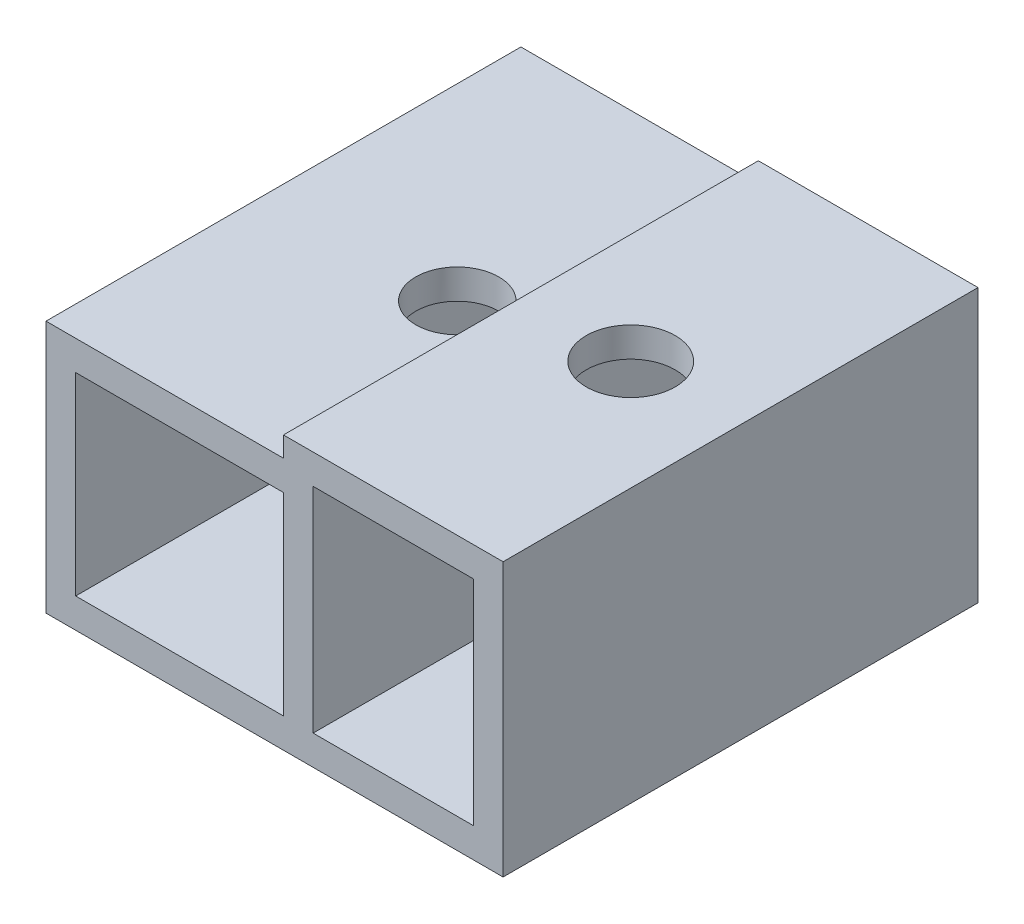
ISO-10303-21;
HEADER;
FILE_DESCRIPTION(('STEP AP214'),'2;1');
FILE_NAME('part.step','',(''),(''),'','','');
FILE_SCHEMA(('AUTOMOTIVE_DESIGN { 1 0 10303 214 1 1 1 1 }'));
ENDSEC;
DATA;
#1=APPLICATION_CONTEXT('core data for automotive mechanical design processes');
#2=APPLICATION_PROTOCOL_DEFINITION('international standard','automotive_design',2000,#1);
#3=PRODUCT_CONTEXT('',#1,'mechanical');
#4=PRODUCT('Part','Part','',(#3));
#5=PRODUCT_RELATED_PRODUCT_CATEGORY('part','',(#4));
#6=PRODUCT_DEFINITION_FORMATION('','',#4);
#7=PRODUCT_DEFINITION_CONTEXT('part definition',#1,'design');
#8=PRODUCT_DEFINITION('design','',#6,#7);
#9=PRODUCT_DEFINITION_SHAPE('','',#8);
#10=(LENGTH_UNIT() NAMED_UNIT(*) SI_UNIT(.MILLI.,.METRE.));
#11=(NAMED_UNIT(*) PLANE_ANGLE_UNIT() SI_UNIT($,.RADIAN.));
#12=(NAMED_UNIT(*) SI_UNIT($,.STERADIAN.) SOLID_ANGLE_UNIT());
#13=UNCERTAINTY_MEASURE_WITH_UNIT(LENGTH_MEASURE(1.E-05),#10,'distance_accuracy_value','');
#14=(GEOMETRIC_REPRESENTATION_CONTEXT(3) GLOBAL_UNCERTAINTY_ASSIGNED_CONTEXT((#13)) GLOBAL_UNIT_ASSIGNED_CONTEXT((#10,
#11,#12)) REPRESENTATION_CONTEXT('',''));
#15=CARTESIAN_POINT('',(0.,0.,0.));
#16=DIRECTION('',(0.,0.,1.));
#17=DIRECTION('',(1.,0.,0.));
#18=AXIS2_PLACEMENT_3D('',#15,#16,#17);
#19=CARTESIAN_POINT('',(0.,6.34999999999998,101.6));
#20=DIRECTION('',(0.,-1.,0.));
#21=DIRECTION('',(1.,0.,0.));
#22=AXIS2_PLACEMENT_3D('',#19,#20,#21);
#23=PLANE('',#22);
#24=DIRECTION('',(-1.,0.,0.));
#25=VECTOR('',#24,1.);
#26=CARTESIAN_POINT('',(0.,6.34999999999998,0.));
#27=LINE('',#26,#25);
#28=CARTESIAN_POINT('',(91.44,6.35,0.));
#29=VERTEX_POINT('',#28);
#30=CARTESIAN_POINT('',(57.15,6.34999999999999,0.));
#31=VERTEX_POINT('',#30);
#32=EDGE_CURVE('E192',#29,#31,#27,.T.);
#33=ORIENTED_EDGE('',*,*,#32,.T.);
#34=DIRECTION('',(0.,0.,-1.));
#35=VECTOR('',#34,1.);
#36=CARTESIAN_POINT('',(57.15,6.34999999999999,101.6));
#37=LINE('',#36,#35);
#38=CARTESIAN_POINT('',(57.15,6.34999999999999,101.6));
#39=VERTEX_POINT('',#38);
#40=EDGE_CURVE('E11',#39,#31,#37,.T.);
#41=ORIENTED_EDGE('',*,*,#40,.F.);
#42=DIRECTION('',(-1.,0.,0.));
#43=VECTOR('',#42,1.);
#44=CARTESIAN_POINT('',(0.,6.34999999999998,101.6));
#45=LINE('',#44,#43);
#46=CARTESIAN_POINT('',(91.44,6.35,101.6));
#47=VERTEX_POINT('',#46);
#48=EDGE_CURVE('E149',#47,#39,#45,.T.);
#49=ORIENTED_EDGE('',*,*,#48,.F.);
#50=DIRECTION('',(0.,0.,-1.));
#51=VECTOR('',#50,1.);
#52=CARTESIAN_POINT('',(91.44,6.35,101.6));
#53=LINE('',#52,#51);
#54=EDGE_CURVE('E200',#47,#29,#53,.T.);
#55=ORIENTED_EDGE('',*,*,#54,.T.);
#56=EDGE_LOOP('',(#33,#41,#49,#55));
#57=FACE_BOUND('',#56,.T.);
#58=ADVANCED_FACE('F35',(#57),#23,.F.);
#59=CARTESIAN_POINT('',(57.15,0.,101.6));
#60=DIRECTION('',(-1.,0.,0.));
#61=DIRECTION('',(0.,0.,1.));
#62=AXIS2_PLACEMENT_3D('',#59,#60,#61);
#63=PLANE('',#62);
#64=DIRECTION('',(0.,1.,0.));
#65=VECTOR('',#64,1.);
#66=CARTESIAN_POINT('',(57.15,0.,0.));
#67=LINE('',#66,#65);
#68=CARTESIAN_POINT('',(57.15,52.07,0.));
#69=VERTEX_POINT('',#68);
#70=EDGE_CURVE('E155',#31,#69,#67,.T.);
#71=ORIENTED_EDGE('',*,*,#70,.T.);
#72=DIRECTION('',(0.,0.,-1.));
#73=VECTOR('',#72,1.);
#74=CARTESIAN_POINT('',(57.15,52.07,101.6));
#75=LINE('',#74,#73);
#76=CARTESIAN_POINT('',(57.15,52.07,101.6));
#77=VERTEX_POINT('',#76);
#78=EDGE_CURVE('E45',#77,#69,#75,.T.);
#79=ORIENTED_EDGE('',*,*,#78,.F.);
#80=DIRECTION('',(0.,1.,0.));
#81=VECTOR('',#80,1.);
#82=CARTESIAN_POINT('',(57.15,0.,101.6));
#83=LINE('',#82,#81);
#84=EDGE_CURVE('E143',#39,#77,#83,.T.);
#85=ORIENTED_EDGE('',*,*,#84,.F.);
#86=ORIENTED_EDGE('',*,*,#40,.T.);
#87=EDGE_LOOP('',(#71,#79,#85,#86));
#88=FACE_BOUND('',#87,.T.);
#89=ADVANCED_FACE('F154',(#88),#63,.F.);
#90=CARTESIAN_POINT('',(0.,52.07,101.6));
#91=DIRECTION('',(0.,-1.,0.));
#92=DIRECTION('',(1.,0.,0.));
#93=AXIS2_PLACEMENT_3D('',#90,#91,#92);
#94=PLANE('',#93);
#95=CARTESIAN_POINT('',(74.295,52.07,50.8));
#96=DIRECTION('',(0.,-1.,0.));
#97=DIRECTION('',(1.,0.,0.));
#98=AXIS2_PLACEMENT_3D('',#95,#96,#97);
#99=CIRCLE('',#98,9.52500000000001);
#100=CARTESIAN_POINT('',(83.82,52.07,50.8));
#101=VERTEX_POINT('',#100);
#102=EDGE_CURVE('E170',#101,#101,#99,.T.);
#103=ORIENTED_EDGE('',*,*,#102,.F.);
#104=EDGE_LOOP('',(#103));
#105=FACE_BOUND('',#104,.T.);
#106=DIRECTION('',(-1.,0.,0.));
#107=VECTOR('',#106,1.);
#108=CARTESIAN_POINT('',(0.,52.07,0.));
#109=LINE('',#108,#107);
#110=CARTESIAN_POINT('',(91.44,52.07,0.));
#111=VERTEX_POINT('',#110);
#112=EDGE_CURVE('E196',#111,#69,#109,.T.);
#113=ORIENTED_EDGE('',*,*,#112,.F.);
#114=DIRECTION('',(0.,0.,-1.));
#115=VECTOR('',#114,1.);
#116=CARTESIAN_POINT('',(91.44,52.07,101.6));
#117=LINE('',#116,#115);
#118=CARTESIAN_POINT('',(91.44,52.07,101.6));
#119=VERTEX_POINT('',#118);
#120=EDGE_CURVE('E100',#119,#111,#117,.T.);
#121=ORIENTED_EDGE('',*,*,#120,.F.);
#122=DIRECTION('',(-1.,0.,0.));
#123=VECTOR('',#122,1.);
#124=CARTESIAN_POINT('',(0.,52.07,101.6));
#125=LINE('',#124,#123);
#126=EDGE_CURVE('E147',#119,#77,#125,.T.);
#127=ORIENTED_EDGE('',*,*,#126,.T.);
#128=ORIENTED_EDGE('',*,*,#78,.T.);
#129=EDGE_LOOP('',(#113,#121,#127,#128));
#130=FACE_BOUND('',#129,.T.);
#131=ADVANCED_FACE('F160',(#105,#130),#94,.T.);
#132=CARTESIAN_POINT('',(0.,54.102,101.6));
#133=DIRECTION('',(0.,-1.,0.));
#134=DIRECTION('',(0.,0.,-1.));
#135=AXIS2_PLACEMENT_3D('',#132,#133,#134);
#136=PLANE('',#135);
#137=CARTESIAN_POINT('',(40.2406408631118,54.102,53.848));
#138=DIRECTION('',(0.,1.,0.));
#139=DIRECTION('',(0.,0.,1.));
#140=AXIS2_PLACEMENT_3D('',#137,#138,#139);
#141=CIRCLE('',#140,8.88999999999999);
#142=CARTESIAN_POINT('',(40.2406408631118,54.102,62.738));
#143=VERTEX_POINT('',#142);
#144=EDGE_CURVE('E345',#143,#143,#141,.T.);
#145=ORIENTED_EDGE('',*,*,#144,.F.);
#146=EDGE_LOOP('',(#145));
#147=FACE_BOUND('',#146,.T.);
#148=DIRECTION('',(-1.,0.,0.));
#149=VECTOR('',#148,1.);
#150=CARTESIAN_POINT('',(0.,54.102,0.));
#151=LINE('',#150,#149);
#152=CARTESIAN_POINT('',(50.8,54.102,0.));
#153=VERTEX_POINT('',#152);
#154=CARTESIAN_POINT('',(0.,54.102,0.));
#155=VERTEX_POINT('',#154);
#156=EDGE_CURVE('E179',#153,#155,#151,.T.);
#157=ORIENTED_EDGE('',*,*,#156,.T.);
#158=DIRECTION('',(0.,0.,-1.));
#159=VECTOR('',#158,1.);
#160=CARTESIAN_POINT('',(0.,54.102,101.6));
#161=LINE('',#160,#159);
#162=CARTESIAN_POINT('',(0.,54.102,101.6));
#163=VERTEX_POINT('',#162);
#164=EDGE_CURVE('E202',#163,#155,#161,.T.);
#165=ORIENTED_EDGE('',*,*,#164,.F.);
#166=DIRECTION('',(-1.,0.,0.));
#167=VECTOR('',#166,1.);
#168=CARTESIAN_POINT('',(0.,54.102,101.6));
#169=LINE('',#168,#167);
#170=CARTESIAN_POINT('',(50.8,54.102,101.6));
#171=VERTEX_POINT('',#170);
#172=EDGE_CURVE('E252',#171,#163,#169,.T.);
#173=ORIENTED_EDGE('',*,*,#172,.F.);
#174=DIRECTION('',(0.,0.,-1.));
#175=VECTOR('',#174,1.);
#176=CARTESIAN_POINT('',(50.8,54.102,101.6));
#177=LINE('',#176,#175);
#178=EDGE_CURVE('E204',#171,#153,#177,.T.);
#179=ORIENTED_EDGE('',*,*,#178,.T.);
#180=EDGE_LOOP('',(#157,#165,#173,#179));
#181=FACE_BOUND('',#180,.T.);
#182=ADVANCED_FACE('F275',(#147,#181),#136,.F.);
#183=CARTESIAN_POINT('',(0.,0.,101.6));
#184=DIRECTION('',(1.,0.,0.));
#185=DIRECTION('',(0.,1.,0.));
#186=AXIS2_PLACEMENT_3D('',#183,#184,#185);
#187=PLANE('',#186);
#188=DIRECTION('',(0.,-1.,0.));
#189=VECTOR('',#188,1.);
#190=CARTESIAN_POINT('',(0.,0.,0.));
#191=LINE('',#190,#189);
#192=CARTESIAN_POINT('',(0.,0.,0.));
#193=VERTEX_POINT('',#192);
#194=EDGE_CURVE('E182',#155,#193,#191,.T.);
#195=ORIENTED_EDGE('',*,*,#194,.T.);
#196=DIRECTION('',(0.,0.,-1.));
#197=VECTOR('',#196,1.);
#198=CARTESIAN_POINT('',(0.,0.,101.6));
#199=LINE('',#198,#197);
#200=CARTESIAN_POINT('',(0.,0.,101.6));
#201=VERTEX_POINT('',#200);
#202=EDGE_CURVE('E216',#201,#193,#199,.T.);
#203=ORIENTED_EDGE('',*,*,#202,.F.);
#204=DIRECTION('',(0.,-1.,0.));
#205=VECTOR('',#204,1.);
#206=CARTESIAN_POINT('',(0.,0.,101.6));
#207=LINE('',#206,#205);
#208=EDGE_CURVE('E255',#163,#201,#207,.T.);
#209=ORIENTED_EDGE('',*,*,#208,.F.);
#210=ORIENTED_EDGE('',*,*,#164,.T.);
#211=EDGE_LOOP('',(#195,#203,#209,#210));
#212=FACE_BOUND('',#211,.T.);
#213=ADVANCED_FACE('F277',(#212),#187,.F.);
#214=CARTESIAN_POINT('',(0.,0.,101.6));
#215=DIRECTION('',(0.,1.,0.));
#216=DIRECTION('',(0.,0.,1.));
#217=AXIS2_PLACEMENT_3D('',#214,#215,#216);
#218=PLANE('',#217);
#219=CARTESIAN_POINT('',(40.132,0.,53.848));
#220=DIRECTION('',(0.,1.,0.));
#221=DIRECTION('',(0.,0.,1.));
#222=AXIS2_PLACEMENT_3D('',#219,#220,#221);
#223=CIRCLE('',#222,8.5725);
#224=CARTESIAN_POINT('',(40.132,0.,62.4205));
#225=VERTEX_POINT('',#224);
#226=EDGE_CURVE('E342',#225,#225,#223,.T.);
#227=ORIENTED_EDGE('',*,*,#226,.T.);
#228=EDGE_LOOP('',(#227));
#229=FACE_BOUND('',#228,.T.);
#230=DIRECTION('',(1.,0.,0.));
#231=VECTOR('',#230,1.);
#232=CARTESIAN_POINT('',(0.,0.,0.));
#233=LINE('',#232,#231);
#234=CARTESIAN_POINT('',(97.79,0.,0.));
#235=VERTEX_POINT('',#234);
#236=EDGE_CURVE('E184',#193,#235,#233,.T.);
#237=ORIENTED_EDGE('',*,*,#236,.T.);
#238=DIRECTION('',(0.,0.,-1.));
#239=VECTOR('',#238,1.);
#240=CARTESIAN_POINT('',(97.79,0.,101.6));
#241=LINE('',#240,#239);
#242=CARTESIAN_POINT('',(97.79,0.,101.6));
#243=VERTEX_POINT('',#242);
#244=EDGE_CURVE('E213',#243,#235,#241,.T.);
#245=ORIENTED_EDGE('',*,*,#244,.F.);
#246=DIRECTION('',(1.,0.,0.));
#247=VECTOR('',#246,1.);
#248=CARTESIAN_POINT('',(0.,0.,101.6));
#249=LINE('',#248,#247);
#250=EDGE_CURVE('E257',#201,#243,#249,.T.);
#251=ORIENTED_EDGE('',*,*,#250,.F.);
#252=ORIENTED_EDGE('',*,*,#202,.T.);
#253=EDGE_LOOP('',(#237,#245,#251,#252));
#254=FACE_BOUND('',#253,.T.);
#255=ADVANCED_FACE('F284',(#229,#254),#218,.F.);
#256=CARTESIAN_POINT('',(97.79,0.,101.6));
#257=DIRECTION('',(-1.,0.,0.));
#258=DIRECTION('',(0.,-1.,0.));
#259=AXIS2_PLACEMENT_3D('',#256,#257,#258);
#260=PLANE('',#259);
#261=DIRECTION('',(0.,1.,0.));
#262=VECTOR('',#261,1.);
#263=CARTESIAN_POINT('',(97.79,0.,0.));
#264=LINE('',#263,#262);
#265=CARTESIAN_POINT('',(97.79,58.42,0.));
#266=VERTEX_POINT('',#265);
#267=EDGE_CURVE('E186',#235,#266,#264,.T.);
#268=ORIENTED_EDGE('',*,*,#267,.T.);
#269=DIRECTION('',(0.,0.,-1.));
#270=VECTOR('',#269,1.);
#271=CARTESIAN_POINT('',(97.79,58.42,101.6));
#272=LINE('',#271,#270);
#273=CARTESIAN_POINT('',(97.79,58.42,101.6));
#274=VERTEX_POINT('',#273);
#275=EDGE_CURVE('E210',#274,#266,#272,.T.);
#276=ORIENTED_EDGE('',*,*,#275,.F.);
#277=DIRECTION('',(0.,1.,0.));
#278=VECTOR('',#277,1.);
#279=CARTESIAN_POINT('',(97.79,0.,101.6));
#280=LINE('',#279,#278);
#281=EDGE_CURVE('E259',#243,#274,#280,.T.);
#282=ORIENTED_EDGE('',*,*,#281,.F.);
#283=ORIENTED_EDGE('',*,*,#244,.T.);
#284=EDGE_LOOP('',(#268,#276,#282,#283));
#285=FACE_BOUND('',#284,.T.);
#286=ADVANCED_FACE('F288',(#285),#260,.F.);
#287=CARTESIAN_POINT('',(0.,58.42,101.6));
#288=DIRECTION('',(0.,-1.,0.));
#289=DIRECTION('',(1.,0.,0.));
#290=AXIS2_PLACEMENT_3D('',#287,#288,#289);
#291=PLANE('',#290);
#292=CARTESIAN_POINT('',(74.295,58.42,50.8));
#293=DIRECTION('',(0.,1.,0.));
#294=DIRECTION('',(-1.,0.,0.));
#295=AXIS2_PLACEMENT_3D('',#292,#293,#294);
#296=CIRCLE('',#295,9.52500000000001);
#297=CARTESIAN_POINT('',(64.77,58.42,50.8));
#298=VERTEX_POINT('',#297);
#299=EDGE_CURVE('E350',#298,#298,#296,.T.);
#300=ORIENTED_EDGE('',*,*,#299,.F.);
#301=EDGE_LOOP('',(#300));
#302=FACE_BOUND('',#301,.T.);
#303=DIRECTION('',(-1.,0.,0.));
#304=VECTOR('',#303,1.);
#305=CARTESIAN_POINT('',(0.,58.42,0.));
#306=LINE('',#305,#304);
#307=CARTESIAN_POINT('',(50.8,58.42,0.));
#308=VERTEX_POINT('',#307);
#309=EDGE_CURVE('E188',#266,#308,#306,.T.);
#310=ORIENTED_EDGE('',*,*,#309,.T.);
#311=DIRECTION('',(0.,0.,-1.));
#312=VECTOR('',#311,1.);
#313=CARTESIAN_POINT('',(50.8,58.42,101.6));
#314=LINE('',#313,#312);
#315=CARTESIAN_POINT('',(50.8,58.42,101.6));
#316=VERTEX_POINT('',#315);
#317=EDGE_CURVE('E207',#316,#308,#314,.T.);
#318=ORIENTED_EDGE('',*,*,#317,.F.);
#319=DIRECTION('',(-1.,0.,0.));
#320=VECTOR('',#319,1.);
#321=CARTESIAN_POINT('',(0.,58.42,101.6));
#322=LINE('',#321,#320);
#323=EDGE_CURVE('E261',#274,#316,#322,.T.);
#324=ORIENTED_EDGE('',*,*,#323,.F.);
#325=ORIENTED_EDGE('',*,*,#275,.T.);
#326=EDGE_LOOP('',(#310,#318,#324,#325));
#327=FACE_BOUND('',#326,.T.);
#328=ADVANCED_FACE('F291',(#302,#327),#291,.F.);
#329=CARTESIAN_POINT('',(50.8,0.,101.6));
#330=DIRECTION('',(-1.,0.,0.));
#331=DIRECTION('',(0.,0.,1.));
#332=AXIS2_PLACEMENT_3D('',#329,#330,#331);
#333=PLANE('',#332);
#334=DIRECTION('',(0.,1.,0.));
#335=VECTOR('',#334,1.);
#336=CARTESIAN_POINT('',(50.8,0.,0.));
#337=LINE('',#336,#335);
#338=CARTESIAN_POINT('',(50.8,6.35,0.));
#339=VERTEX_POINT('',#338);
#340=CARTESIAN_POINT('',(50.8,47.752,0.));
#341=VERTEX_POINT('',#340);
#342=EDGE_CURVE('E166',#339,#341,#337,.T.);
#343=ORIENTED_EDGE('',*,*,#342,.F.);
#344=DIRECTION('',(0.,0.,-1.));
#345=VECTOR('',#344,1.);
#346=CARTESIAN_POINT('',(50.8,6.35,101.6));
#347=LINE('',#346,#345);
#348=CARTESIAN_POINT('',(50.8,6.35,101.6));
#349=VERTEX_POINT('',#348);
#350=EDGE_CURVE('E111',#349,#339,#347,.T.);
#351=ORIENTED_EDGE('',*,*,#350,.F.);
#352=DIRECTION('',(0.,1.,0.));
#353=VECTOR('',#352,1.);
#354=CARTESIAN_POINT('',(50.8,0.,101.6));
#355=LINE('',#354,#353);
#356=CARTESIAN_POINT('',(50.8,47.752,101.6));
#357=VERTEX_POINT('',#356);
#358=EDGE_CURVE('E199',#349,#357,#355,.T.);
#359=ORIENTED_EDGE('',*,*,#358,.T.);
#360=DIRECTION('',(0.,0.,-1.));
#361=VECTOR('',#360,1.);
#362=CARTESIAN_POINT('',(50.8,47.752,101.6));
#363=LINE('',#362,#361);
#364=EDGE_CURVE('E162',#357,#341,#363,.T.);
#365=ORIENTED_EDGE('',*,*,#364,.T.);
#366=EDGE_LOOP('',(#343,#351,#359,#365));
#367=FACE_BOUND('',#366,.T.);
#368=ADVANCED_FACE('F37',(#367),#333,.T.);
#369=CARTESIAN_POINT('',(0.,6.35,101.6));
#370=DIRECTION('',(0.,1.,0.));
#371=DIRECTION('',(0.,0.,1.));
#372=AXIS2_PLACEMENT_3D('',#369,#370,#371);
#373=PLANE('',#372);
#374=CARTESIAN_POINT('',(40.132,6.35,53.848));
#375=DIRECTION('',(0.,1.,0.));
#376=DIRECTION('',(0.,0.,1.));
#377=AXIS2_PLACEMENT_3D('',#374,#375,#376);
#378=CIRCLE('',#377,8.5725);
#379=CARTESIAN_POINT('',(40.132,6.35,62.4205));
#380=VERTEX_POINT('',#379);
#381=EDGE_CURVE('E340',#380,#380,#378,.T.);
#382=ORIENTED_EDGE('',*,*,#381,.F.);
#383=EDGE_LOOP('',(#382));
#384=FACE_BOUND('',#383,.T.);
#385=DIRECTION('',(1.,0.,0.));
#386=VECTOR('',#385,1.);
#387=CARTESIAN_POINT('',(0.,6.35,0.));
#388=LINE('',#387,#386);
#389=CARTESIAN_POINT('',(6.35,6.35,0.));
#390=VERTEX_POINT('',#389);
#391=EDGE_CURVE('E169',#390,#339,#388,.T.);
#392=ORIENTED_EDGE('',*,*,#391,.F.);
#393=DIRECTION('',(0.,0.,-1.));
#394=VECTOR('',#393,1.);
#395=CARTESIAN_POINT('',(6.35,6.35,101.6));
#396=LINE('',#395,#394);
#397=CARTESIAN_POINT('',(6.35,6.35,101.6));
#398=VERTEX_POINT('',#397);
#399=EDGE_CURVE('E224',#398,#390,#396,.T.);
#400=ORIENTED_EDGE('',*,*,#399,.F.);
#401=DIRECTION('',(1.,0.,0.));
#402=VECTOR('',#401,1.);
#403=CARTESIAN_POINT('',(0.,6.35,101.6));
#404=LINE('',#403,#402);
#405=EDGE_CURVE('E230',#398,#349,#404,.T.);
#406=ORIENTED_EDGE('',*,*,#405,.T.);
#407=ORIENTED_EDGE('',*,*,#350,.T.);
#408=EDGE_LOOP('',(#392,#400,#406,#407));
#409=FACE_BOUND('',#408,.T.);
#410=ADVANCED_FACE('F228',(#384,#409),#373,.T.);
#411=CARTESIAN_POINT('',(6.35,0.,101.6));
#412=DIRECTION('',(1.,0.,0.));
#413=DIRECTION('',(0.,0.,-1.));
#414=AXIS2_PLACEMENT_3D('',#411,#412,#413);
#415=PLANE('',#414);
#416=DIRECTION('',(0.,-1.,0.));
#417=VECTOR('',#416,1.);
#418=CARTESIAN_POINT('',(6.35,0.,0.));
#419=LINE('',#418,#417);
#420=CARTESIAN_POINT('',(6.35,47.752,0.));
#421=VERTEX_POINT('',#420);
#422=EDGE_CURVE('E173',#421,#390,#419,.T.);
#423=ORIENTED_EDGE('',*,*,#422,.F.);
#424=DIRECTION('',(0.,0.,-1.));
#425=VECTOR('',#424,1.);
#426=CARTESIAN_POINT('',(6.35,47.752,101.6));
#427=LINE('',#426,#425);
#428=CARTESIAN_POINT('',(6.35,47.752,101.6));
#429=VERTEX_POINT('',#428);
#430=EDGE_CURVE('E222',#429,#421,#427,.T.);
#431=ORIENTED_EDGE('',*,*,#430,.F.);
#432=DIRECTION('',(0.,-1.,0.));
#433=VECTOR('',#432,1.);
#434=CARTESIAN_POINT('',(6.35,0.,101.6));
#435=LINE('',#434,#433);
#436=EDGE_CURVE('E240',#429,#398,#435,.T.);
#437=ORIENTED_EDGE('',*,*,#436,.T.);
#438=ORIENTED_EDGE('',*,*,#399,.T.);
#439=EDGE_LOOP('',(#423,#431,#437,#438));
#440=FACE_BOUND('',#439,.T.);
#441=ADVANCED_FACE('F237',(#440),#415,.T.);
#442=CARTESIAN_POINT('',(50.8000000000002,1.63268091856642E-13,101.6));
#443=DIRECTION('',(1.,0.,0.));
#444=DIRECTION('',(0.,1.,0.));
#445=AXIS2_PLACEMENT_3D('',#442,#443,#444);
#446=PLANE('',#445);
#447=DIRECTION('',(0.,-1.,0.));
#448=VECTOR('',#447,1.);
#449=CARTESIAN_POINT('',(50.8000000000002,1.63268091856642E-13,0.));
#450=LINE('',#449,#448);
#451=EDGE_CURVE('E190',#308,#153,#450,.T.);
#452=ORIENTED_EDGE('',*,*,#451,.T.);
#453=ORIENTED_EDGE('',*,*,#178,.F.);
#454=DIRECTION('',(0.,-1.,0.));
#455=VECTOR('',#454,1.);
#456=CARTESIAN_POINT('',(50.8000000000002,1.63268091856642E-13,101.6));
#457=LINE('',#456,#455);
#458=EDGE_CURVE('E263',#316,#171,#457,.T.);
#459=ORIENTED_EDGE('',*,*,#458,.F.);
#460=ORIENTED_EDGE('',*,*,#317,.T.);
#461=EDGE_LOOP('',(#452,#453,#459,#460));
#462=FACE_BOUND('',#461,.T.);
#463=ADVANCED_FACE('F271',(#462),#446,.F.);
#464=CARTESIAN_POINT('',(0.,47.752,101.6));
#465=DIRECTION('',(0.,-1.,0.));
#466=DIRECTION('',(0.,0.,-1.));
#467=AXIS2_PLACEMENT_3D('',#464,#465,#466);
#468=PLANE('',#467);
#469=CARTESIAN_POINT('',(40.2406408631118,47.752,53.848));
#470=DIRECTION('',(0.,-1.,0.));
#471=DIRECTION('',(0.,0.,-1.));
#472=AXIS2_PLACEMENT_3D('',#469,#470,#471);
#473=CIRCLE('',#472,8.88999999999999);
#474=CARTESIAN_POINT('',(40.2406408631118,47.752,44.958));
#475=VERTEX_POINT('',#474);
#476=EDGE_CURVE('E39',#475,#475,#473,.T.);
#477=ORIENTED_EDGE('',*,*,#476,.F.);
#478=EDGE_LOOP('',(#477));
#479=FACE_BOUND('',#478,.T.);
#480=DIRECTION('',(-1.,0.,0.));
#481=VECTOR('',#480,1.);
#482=CARTESIAN_POINT('',(0.,47.752,0.));
#483=LINE('',#482,#481);
#484=EDGE_CURVE('E176',#341,#421,#483,.T.);
#485=ORIENTED_EDGE('',*,*,#484,.F.);
#486=ORIENTED_EDGE('',*,*,#364,.F.);
#487=DIRECTION('',(-1.,0.,0.));
#488=VECTOR('',#487,1.);
#489=CARTESIAN_POINT('',(0.,47.752,101.6));
#490=LINE('',#489,#488);
#491=EDGE_CURVE('E246',#357,#429,#490,.T.);
#492=ORIENTED_EDGE('',*,*,#491,.T.);
#493=ORIENTED_EDGE('',*,*,#430,.T.);
#494=EDGE_LOOP('',(#485,#486,#492,#493));
#495=FACE_BOUND('',#494,.T.);
#496=ADVANCED_FACE('F300',(#479,#495),#468,.T.);
#497=CARTESIAN_POINT('',(91.44,0.,101.6));
#498=DIRECTION('',(1.,0.,0.));
#499=DIRECTION('',(0.,1.,0.));
#500=AXIS2_PLACEMENT_3D('',#497,#498,#499);
#501=PLANE('',#500);
#502=DIRECTION('',(0.,-1.,0.));
#503=VECTOR('',#502,1.);
#504=CARTESIAN_POINT('',(91.44,0.,0.));
#505=LINE('',#504,#503);
#506=EDGE_CURVE('E103',#111,#29,#505,.T.);
#507=ORIENTED_EDGE('',*,*,#506,.T.);
#508=ORIENTED_EDGE('',*,*,#54,.F.);
#509=DIRECTION('',(0.,-1.,0.));
#510=VECTOR('',#509,1.);
#511=CARTESIAN_POINT('',(91.44,0.,101.6));
#512=LINE('',#511,#510);
#513=EDGE_CURVE('E54',#119,#47,#512,.T.);
#514=ORIENTED_EDGE('',*,*,#513,.F.);
#515=ORIENTED_EDGE('',*,*,#120,.T.);
#516=EDGE_LOOP('',(#507,#508,#514,#515));
#517=FACE_BOUND('',#516,.T.);
#518=ADVANCED_FACE('F298',(#517),#501,.F.);
#519=CARTESIAN_POINT('',(0.,0.,101.6));
#520=DIRECTION('',(0.,0.,1.));
#521=DIRECTION('',(1.,0.,0.));
#522=AXIS2_PLACEMENT_3D('',#519,#520,#521);
#523=PLANE('',#522);
#524=ORIENTED_EDGE('',*,*,#358,.F.);
#525=ORIENTED_EDGE('',*,*,#405,.F.);
#526=ORIENTED_EDGE('',*,*,#436,.F.);
#527=ORIENTED_EDGE('',*,*,#491,.F.);
#528=EDGE_LOOP('',(#524,#525,#526,#527));
#529=FACE_BOUND('',#528,.T.);
#530=ORIENTED_EDGE('',*,*,#172,.T.);
#531=ORIENTED_EDGE('',*,*,#208,.T.);
#532=ORIENTED_EDGE('',*,*,#250,.T.);
#533=ORIENTED_EDGE('',*,*,#281,.T.);
#534=ORIENTED_EDGE('',*,*,#323,.T.);
#535=ORIENTED_EDGE('',*,*,#458,.T.);
#536=EDGE_LOOP('',(#530,#531,#532,#533,#534,#535));
#537=FACE_BOUND('',#536,.T.);
#538=ORIENTED_EDGE('',*,*,#48,.T.);
#539=ORIENTED_EDGE('',*,*,#84,.T.);
#540=ORIENTED_EDGE('',*,*,#126,.F.);
#541=ORIENTED_EDGE('',*,*,#513,.T.);
#542=EDGE_LOOP('',(#538,#539,#540,#541));
#543=FACE_BOUND('',#542,.T.);
#544=ADVANCED_FACE('F145',(#529,#537,#543),#523,.T.);
#545=CARTESIAN_POINT('',(0.,0.,0.));
#546=DIRECTION('',(0.,0.,1.));
#547=DIRECTION('',(1.,0.,0.));
#548=AXIS2_PLACEMENT_3D('',#545,#546,#547);
#549=PLANE('',#548);
#550=ORIENTED_EDGE('',*,*,#342,.T.);
#551=ORIENTED_EDGE('',*,*,#484,.T.);
#552=ORIENTED_EDGE('',*,*,#422,.T.);
#553=ORIENTED_EDGE('',*,*,#391,.T.);
#554=EDGE_LOOP('',(#550,#551,#552,#553));
#555=FACE_BOUND('',#554,.T.);
#556=ORIENTED_EDGE('',*,*,#156,.F.);
#557=ORIENTED_EDGE('',*,*,#451,.F.);
#558=ORIENTED_EDGE('',*,*,#309,.F.);
#559=ORIENTED_EDGE('',*,*,#267,.F.);
#560=ORIENTED_EDGE('',*,*,#236,.F.);
#561=ORIENTED_EDGE('',*,*,#194,.F.);
#562=EDGE_LOOP('',(#556,#557,#558,#559,#560,#561));
#563=FACE_BOUND('',#562,.T.);
#564=ORIENTED_EDGE('',*,*,#32,.F.);
#565=ORIENTED_EDGE('',*,*,#506,.F.);
#566=ORIENTED_EDGE('',*,*,#112,.T.);
#567=ORIENTED_EDGE('',*,*,#70,.F.);
#568=EDGE_LOOP('',(#564,#565,#566,#567));
#569=FACE_BOUND('',#568,.T.);
#570=ADVANCED_FACE('F233',(#555,#563,#569),#549,.F.);
#571=CARTESIAN_POINT('',(74.295,45.72,50.8));
#572=DIRECTION('',(0.,1.,0.));
#573=DIRECTION('',(-1.,0.,0.));
#574=AXIS2_PLACEMENT_3D('',#571,#572,#573);
#575=CYLINDRICAL_SURFACE('',#574,9.52500000000001);
#576=ORIENTED_EDGE('',*,*,#102,.T.);
#577=EDGE_LOOP('',(#576));
#578=FACE_BOUND('',#577,.T.);
#579=ORIENTED_EDGE('',*,*,#299,.T.);
#580=EDGE_LOOP('',(#579));
#581=FACE_BOUND('',#580,.T.);
#582=ADVANCED_FACE('F294',(#578,#581),#575,.F.);
#583=CARTESIAN_POINT('',(40.2406408631118,41.402,53.848));
#584=DIRECTION('',(0.,1.,0.));
#585=DIRECTION('',(0.,0.,1.));
#586=AXIS2_PLACEMENT_3D('',#583,#584,#585);
#587=CYLINDRICAL_SURFACE('',#586,8.88999999999999);
#588=ORIENTED_EDGE('',*,*,#476,.T.);
#589=EDGE_LOOP('',(#588));
#590=FACE_BOUND('',#589,.T.);
#591=ORIENTED_EDGE('',*,*,#144,.T.);
#592=EDGE_LOOP('',(#591));
#593=FACE_BOUND('',#592,.T.);
#594=ADVANCED_FACE('F428',(#590,#593),#587,.F.);
#595=CARTESIAN_POINT('',(40.132,-6.35,53.848));
#596=DIRECTION('',(0.,1.,0.));
#597=DIRECTION('',(0.,0.,1.));
#598=AXIS2_PLACEMENT_3D('',#595,#596,#597);
#599=CYLINDRICAL_SURFACE('',#598,8.5725);
#600=ORIENTED_EDGE('',*,*,#381,.T.);
#601=EDGE_LOOP('',(#600));
#602=FACE_BOUND('',#601,.T.);
#603=ORIENTED_EDGE('',*,*,#226,.F.);
#604=EDGE_LOOP('',(#603));
#605=FACE_BOUND('',#604,.T.);
#606=ADVANCED_FACE('F433',(#602,#605),#599,.F.);
#607=CLOSED_SHELL('',(#58,#89,#131,#182,#213,#255,#286,#328,#368,#410,#441,#463,#496,#518,#544,
#570,#582,#594,#606));
#608=MANIFOLD_SOLID_BREP('B2',#607);
#609=ADVANCED_BREP_SHAPE_REPRESENTATION('',(#18,#608),#14);
#610=SHAPE_DEFINITION_REPRESENTATION(#9,#609);
ENDSEC;
END-ISO-10303-21;
